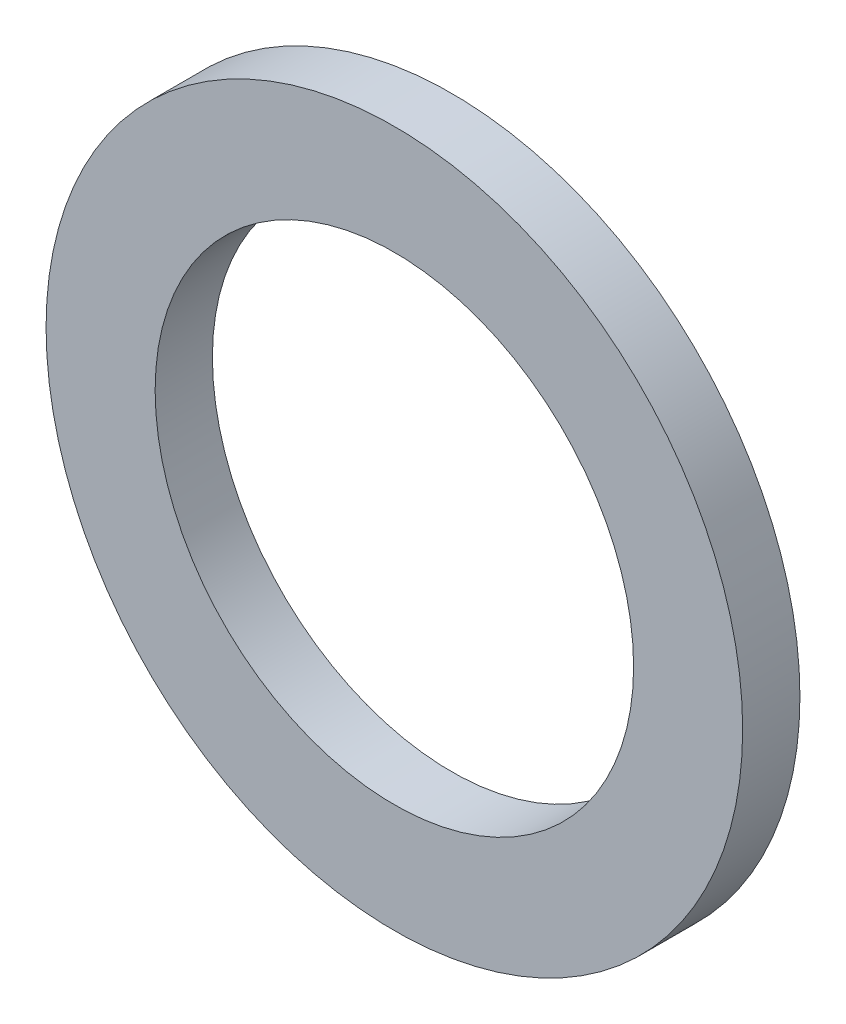
ISO-10303-21;
HEADER;
FILE_DESCRIPTION(('STEP AP214'),'2;1');
FILE_NAME('part.step','',(''),(''),'','','');
FILE_SCHEMA(('AUTOMOTIVE_DESIGN { 1 0 10303 214 1 1 1 1 }'));
ENDSEC;
DATA;
#1=APPLICATION_CONTEXT('core data for automotive mechanical design processes');
#2=APPLICATION_PROTOCOL_DEFINITION('international standard','automotive_design',2000,#1);
#3=PRODUCT_CONTEXT('',#1,'mechanical');
#4=PRODUCT('Part','Part','',(#3));
#5=PRODUCT_RELATED_PRODUCT_CATEGORY('part','',(#4));
#6=PRODUCT_DEFINITION_FORMATION('','',#4);
#7=PRODUCT_DEFINITION_CONTEXT('part definition',#1,'design');
#8=PRODUCT_DEFINITION('design','',#6,#7);
#9=PRODUCT_DEFINITION_SHAPE('','',#8);
#10=(LENGTH_UNIT() NAMED_UNIT(*) SI_UNIT(.MILLI.,.METRE.));
#11=(NAMED_UNIT(*) PLANE_ANGLE_UNIT() SI_UNIT($,.RADIAN.));
#12=(NAMED_UNIT(*) SI_UNIT($,.STERADIAN.) SOLID_ANGLE_UNIT());
#13=UNCERTAINTY_MEASURE_WITH_UNIT(LENGTH_MEASURE(1.E-05),#10,'distance_accuracy_value','');
#14=(GEOMETRIC_REPRESENTATION_CONTEXT(3) GLOBAL_UNCERTAINTY_ASSIGNED_CONTEXT((#13)) GLOBAL_UNIT_ASSIGNED_CONTEXT((#10,
#11,#12)) REPRESENTATION_CONTEXT('',''));
#15=CARTESIAN_POINT('',(0.,0.,0.));
#16=DIRECTION('',(0.,0.,1.));
#17=DIRECTION('',(1.,0.,0.));
#18=AXIS2_PLACEMENT_3D('',#15,#16,#17);
#19=CARTESIAN_POINT('',(0.,0.,1.0668));
#20=DIRECTION('',(0.,0.,1.));
#21=DIRECTION('',(1.,0.,0.));
#22=AXIS2_PLACEMENT_3D('',#19,#20,#21);
#23=PLANE('',#22);
#24=CARTESIAN_POINT('',(0.,0.,1.0668));
#25=DIRECTION('',(0.,0.,1.));
#26=DIRECTION('',(1.,0.,0.));
#27=AXIS2_PLACEMENT_3D('',#24,#25,#26);
#28=CIRCLE('',#27,6.4897);
#29=CARTESIAN_POINT('',(6.4897,0.,1.0668));
#30=VERTEX_POINT('',#29);
#31=EDGE_CURVE('E10',#30,#30,#28,.T.);
#32=ORIENTED_EDGE('',*,*,#31,.T.);
#33=EDGE_LOOP('',(#32));
#34=FACE_BOUND('',#33,.T.);
#35=CARTESIAN_POINT('',(0.,0.,1.0668));
#36=DIRECTION('',(0.,0.,1.));
#37=DIRECTION('',(1.,0.,0.));
#38=AXIS2_PLACEMENT_3D('',#35,#36,#37);
#39=CIRCLE('',#38,4.4577);
#40=CARTESIAN_POINT('',(4.4577,0.,1.0668));
#41=VERTEX_POINT('',#40);
#42=EDGE_CURVE('E48',#41,#41,#39,.T.);
#43=ORIENTED_EDGE('',*,*,#42,.F.);
#44=EDGE_LOOP('',(#43));
#45=FACE_BOUND('',#44,.T.);
#46=ADVANCED_FACE('F37',(#34,#45),#23,.T.);
#47=CARTESIAN_POINT('',(0.,0.,0.));
#48=DIRECTION('',(0.,0.,1.));
#49=DIRECTION('',(1.,0.,0.));
#50=AXIS2_PLACEMENT_3D('',#47,#48,#49);
#51=PLANE('',#50);
#52=CARTESIAN_POINT('',(0.,0.,0.));
#53=DIRECTION('',(0.,0.,1.));
#54=DIRECTION('',(1.,0.,0.));
#55=AXIS2_PLACEMENT_3D('',#52,#53,#54);
#56=CIRCLE('',#55,6.4897);
#57=CARTESIAN_POINT('',(6.4897,0.,0.));
#58=VERTEX_POINT('',#57);
#59=EDGE_CURVE('E41',#58,#58,#56,.T.);
#60=ORIENTED_EDGE('',*,*,#59,.F.);
#61=EDGE_LOOP('',(#60));
#62=FACE_BOUND('',#61,.T.);
#63=CARTESIAN_POINT('',(0.,0.,0.));
#64=DIRECTION('',(0.,0.,1.));
#65=DIRECTION('',(1.,0.,0.));
#66=AXIS2_PLACEMENT_3D('',#63,#64,#65);
#67=CIRCLE('',#66,4.4577);
#68=CARTESIAN_POINT('',(4.4577,0.,0.));
#69=VERTEX_POINT('',#68);
#70=EDGE_CURVE('E50',#69,#69,#67,.T.);
#71=ORIENTED_EDGE('',*,*,#70,.T.);
#72=EDGE_LOOP('',(#71));
#73=FACE_BOUND('',#72,.T.);
#74=ADVANCED_FACE('F60',(#62,#73),#51,.F.);
#75=CARTESIAN_POINT('',(0.,0.,1.0668));
#76=DIRECTION('',(0.,0.,-1.));
#77=DIRECTION('',(-1.,0.,0.));
#78=AXIS2_PLACEMENT_3D('',#75,#76,#77);
#79=CYLINDRICAL_SURFACE('',#78,6.4897);
#80=ORIENTED_EDGE('',*,*,#31,.F.);
#81=EDGE_LOOP('',(#80));
#82=FACE_BOUND('',#81,.T.);
#83=ORIENTED_EDGE('',*,*,#59,.T.);
#84=EDGE_LOOP('',(#83));
#85=FACE_BOUND('',#84,.T.);
#86=ADVANCED_FACE('F39',(#82,#85),#79,.T.);
#87=CARTESIAN_POINT('',(0.,0.,1.0668));
#88=DIRECTION('',(0.,0.,-1.));
#89=DIRECTION('',(-1.,0.,0.));
#90=AXIS2_PLACEMENT_3D('',#87,#88,#89);
#91=CYLINDRICAL_SURFACE('',#90,4.4577);
#92=ORIENTED_EDGE('',*,*,#42,.T.);
#93=EDGE_LOOP('',(#92));
#94=FACE_BOUND('',#93,.T.);
#95=ORIENTED_EDGE('',*,*,#70,.F.);
#96=EDGE_LOOP('',(#95));
#97=FACE_BOUND('',#96,.T.);
#98=ADVANCED_FACE('F56',(#94,#97),#91,.F.);
#99=CLOSED_SHELL('',(#46,#74,#86,#98));
#100=MANIFOLD_SOLID_BREP('B2',#99);
#101=ADVANCED_BREP_SHAPE_REPRESENTATION('',(#18,#100),#14);
#102=SHAPE_DEFINITION_REPRESENTATION(#9,#101);
ENDSEC;
END-ISO-10303-21;
